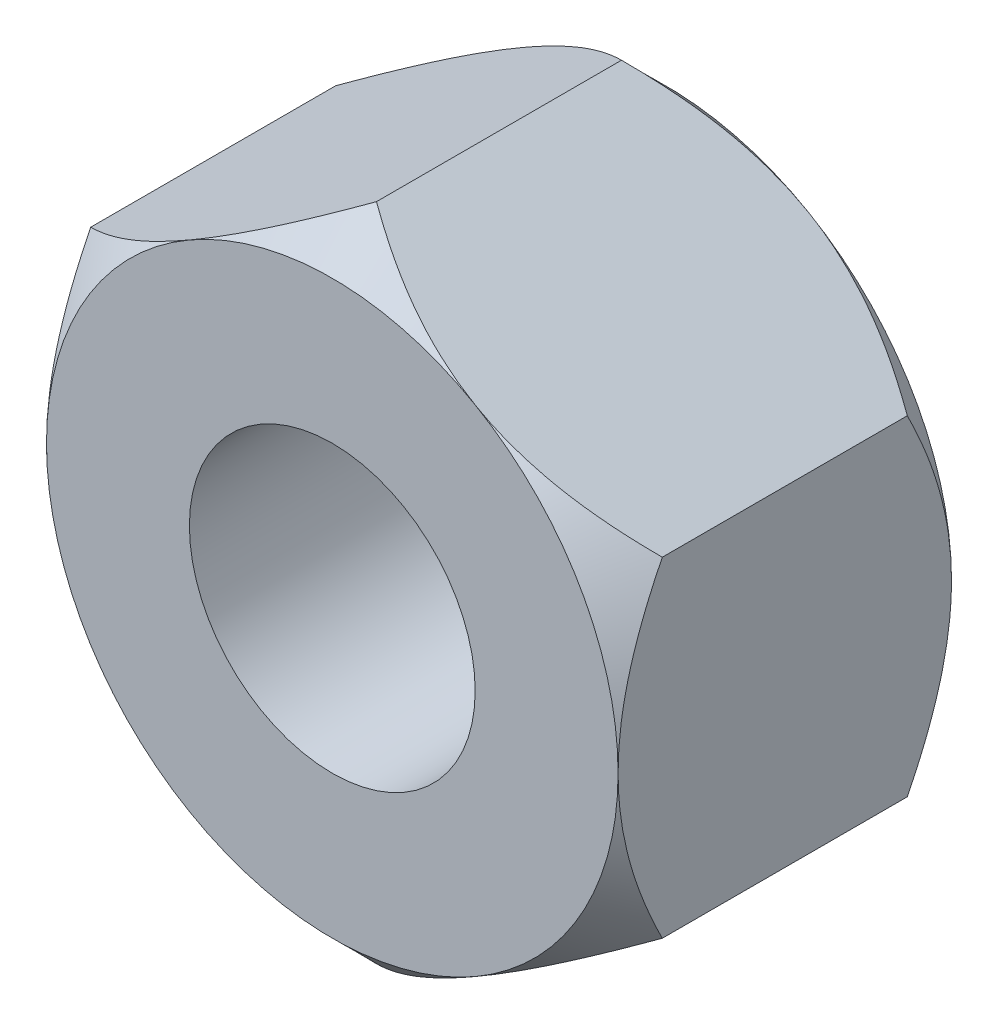
ISO-10303-21;
HEADER;
FILE_DESCRIPTION(('STEP AP214'),'2;1');
FILE_NAME('part.step','',(''),(''),'','','');
FILE_SCHEMA(('AUTOMOTIVE_DESIGN { 1 0 10303 214 1 1 1 1 }'));
ENDSEC;
DATA;
#1=APPLICATION_CONTEXT('core data for automotive mechanical design processes');
#2=APPLICATION_PROTOCOL_DEFINITION('international standard','automotive_design',2000,#1);
#3=PRODUCT_CONTEXT('',#1,'mechanical');
#4=PRODUCT('Part','Part','',(#3));
#5=PRODUCT_RELATED_PRODUCT_CATEGORY('part','',(#4));
#6=PRODUCT_DEFINITION_FORMATION('','',#4);
#7=PRODUCT_DEFINITION_CONTEXT('part definition',#1,'design');
#8=PRODUCT_DEFINITION('design','',#6,#7);
#9=PRODUCT_DEFINITION_SHAPE('','',#8);
#10=(LENGTH_UNIT() NAMED_UNIT(*) SI_UNIT(.MILLI.,.METRE.));
#11=(NAMED_UNIT(*) PLANE_ANGLE_UNIT() SI_UNIT($,.RADIAN.));
#12=(NAMED_UNIT(*) SI_UNIT($,.STERADIAN.) SOLID_ANGLE_UNIT());
#13=UNCERTAINTY_MEASURE_WITH_UNIT(LENGTH_MEASURE(1.E-05),#10,'distance_accuracy_value','');
#14=(GEOMETRIC_REPRESENTATION_CONTEXT(3) GLOBAL_UNCERTAINTY_ASSIGNED_CONTEXT((#13)) GLOBAL_UNIT_ASSIGNED_CONTEXT((#10,
#11,#12)) REPRESENTATION_CONTEXT('',''));
#15=CARTESIAN_POINT('',(0.,0.,0.));
#16=DIRECTION('',(0.,0.,1.));
#17=DIRECTION('',(1.,0.,0.));
#18=AXIS2_PLACEMENT_3D('',#15,#16,#17);
#19=CARTESIAN_POINT('',(0.,0.,3.5));
#20=DIRECTION('',(0.,0.,1.));
#21=DIRECTION('',(1.,0.,0.));
#22=AXIS2_PLACEMENT_3D('',#19,#20,#21);
#23=PLANE('',#22);
#24=CARTESIAN_POINT('',(0.,0.,3.5));
#25=DIRECTION('',(0.,0.,1.));
#26=DIRECTION('',(1.,0.,0.));
#27=AXIS2_PLACEMENT_3D('',#24,#25,#26);
#28=CIRCLE('',#27,1.5);
#29=CARTESIAN_POINT('',(1.5,0.,3.5));
#30=VERTEX_POINT('',#29);
#31=EDGE_CURVE('E236',#30,#30,#28,.T.);
#32=ORIENTED_EDGE('',*,*,#31,.F.);
#33=EDGE_LOOP('',(#32));
#34=FACE_BOUND('',#33,.T.);
#35=CARTESIAN_POINT('',(0.,0.,3.5));
#36=DIRECTION('',(0.,0.,1.));
#37=DIRECTION('',(1.,0.,0.));
#38=AXIS2_PLACEMENT_3D('',#35,#36,#37);
#39=CIRCLE('',#38,3.);
#40=CARTESIAN_POINT('',(1.5,-2.59807621135332,3.5));
#41=VERTEX_POINT('',#40);
#42=CARTESIAN_POINT('',(3.,0.,3.5));
#43=VERTEX_POINT('',#42);
#44=EDGE_CURVE('E291',#41,#43,#39,.T.);
#45=ORIENTED_EDGE('',*,*,#44,.T.);
#46=CARTESIAN_POINT('',(1.5,2.59807621135332,3.5));
#47=VERTEX_POINT('',#46);
#48=EDGE_CURVE('E294',#43,#47,#39,.T.);
#49=ORIENTED_EDGE('',*,*,#48,.T.);
#50=CARTESIAN_POINT('',(-1.5,2.59807621135332,3.5));
#51=VERTEX_POINT('',#50);
#52=EDGE_CURVE('E301',#47,#51,#39,.T.);
#53=ORIENTED_EDGE('',*,*,#52,.T.);
#54=CARTESIAN_POINT('',(-3.,0.,3.5));
#55=VERTEX_POINT('',#54);
#56=EDGE_CURVE('E305',#51,#55,#39,.T.);
#57=ORIENTED_EDGE('',*,*,#56,.T.);
#58=CARTESIAN_POINT('',(-1.5,-2.59807621135332,3.5));
#59=VERTEX_POINT('',#58);
#60=EDGE_CURVE('E298',#55,#59,#39,.T.);
#61=ORIENTED_EDGE('',*,*,#60,.T.);
#62=EDGE_CURVE('E293',#59,#41,#39,.T.);
#63=ORIENTED_EDGE('',*,*,#62,.T.);
#64=EDGE_LOOP('',(#45,#49,#53,#57,#61,#63));
#65=FACE_BOUND('',#64,.T.);
#66=ADVANCED_FACE('F38',(#34,#65),#23,.T.);
#67=CARTESIAN_POINT('',(-3.,-1.73205080756888,3.5));
#68=DIRECTION('',(0.5,0.866025403784439,0.));
#69=DIRECTION('',(-0.866025403784439,0.5,0.));
#70=AXIS2_PLACEMENT_3D('',#67,#68,#69);
#71=PLANE('',#70);
#72=DIRECTION('',(0.,0.,-1.));
#73=VECTOR('',#72,1.);
#74=CARTESIAN_POINT('',(-3.,-1.73205080756888,3.5));
#75=LINE('',#74,#73);
#76=CARTESIAN_POINT('',(-3.,-1.73205080756888,3.03589838486225));
#77=VERTEX_POINT('',#76);
#78=CARTESIAN_POINT('',(-3.,-1.73205080756888,0.464101615137751));
#79=VERTEX_POINT('',#78);
#80=EDGE_CURVE('E233',#77,#79,#75,.T.);
#81=ORIENTED_EDGE('',*,*,#80,.T.);
#82=CARTESIAN_POINT('',(-3.0002,-1.73193533751504,0.464217090964899));
#83=CARTESIAN_POINT('',(-2.89707648504425,-1.79147372663452,0.404729933459537));
#84=CARTESIAN_POINT('',(-2.79222861066935,-1.85200767512883,0.34873659460327));
#85=CARTESIAN_POINT('',(-2.5784323282189,-1.97544301635334,0.246214211516693));
#86=CARTESIAN_POINT('',(-2.46946358862024,-2.03835614749388,0.199742208879042));
#87=CARTESIAN_POINT('',(-2.24973336040297,-2.16521745390422,0.120134803654049));
#88=CARTESIAN_POINT('',(-2.13902782823779,-2.22913332270057,0.0867993157804192));
#89=CARTESIAN_POINT('',(-1.91517958943467,-2.35837216363117,0.0354391591170572));
#90=CARTESIAN_POINT('',(-1.802043720793,-2.42369118784644,0.017376152673354));
#91=CARTESIAN_POINT('',(-1.60705904380729,-2.53626564359199,0.00107852358824866));
#92=CARTESIAN_POINT('',(-1.52546204599786,-2.58337569224233,-0.00133401768844088));
#93=CARTESIAN_POINT('',(-1.36240077116991,-2.67751916315866,0.00273104979486579));
#94=CARTESIAN_POINT('',(-1.28093655070101,-2.7245525527757,0.00921177516605851));
#95=CARTESIAN_POINT('',(-1.11877988766163,-2.81817374583238,0.0306933376529761));
#96=CARTESIAN_POINT('',(-1.03808841121569,-2.86476099147974,0.0457037051050315));
#97=CARTESIAN_POINT('',(-0.87809130210866,-2.95713536549225,0.0834252612037665));
#98=CARTESIAN_POINT('',(-0.798785563690699,-3.00292255491614,0.106135859460585));
#99=CARTESIAN_POINT('',(-0.657993859197242,-3.08420868340511,0.152862299991696));
#100=CARTESIAN_POINT('',(-0.59619627785397,-3.11988753362891,0.175649942818551));
#101=CARTESIAN_POINT('',(-0.473710582479777,-3.19060468282508,0.224897901195199));
#102=CARTESIAN_POINT('',(-0.413022502364393,-3.2256429622163,0.251358328803949));
#103=CARTESIAN_POINT('',(-0.292947002609134,-3.29496858432308,0.307358609529113));
#104=CARTESIAN_POINT('',(-0.23355616770408,-3.32925789884291,0.336888779616121));
#105=CARTESIAN_POINT('',(-0.11587443853273,-3.39720147685869,0.39864070671328));
#106=CARTESIAN_POINT('',(-0.0575828957522648,-3.43085611477447,0.430860811797107));
#107=CARTESIAN_POINT('',(0.000200000000001076,-3.46421708519159,0.4642170909649));
#108=B_SPLINE_CURVE_WITH_KNOTS('',3,(#82,#83,#84,#85,#86,#87,#88,#89,#90,#91,#92,#93,#94,#95,
#96,#97,#98,#99,#100,#101,#102,#103,#104,#105,#106,#107),.UNSPECIFIED.,.F.,.F.,(4,2,2,2,2,2,2,2,
2,2,2,2,4),(0.,0.399603557139307,0.801535286397846,1.19708369162343,1.59163620080173,
1.87398941755845,2.15644160919093,2.43921001247425,2.72195674032138,2.94657516661927,
3.17120044767274,3.3951375283781,3.61893808380739),.UNSPECIFIED.);
#109=CARTESIAN_POINT('',(-1.5,-2.59807621135332,0.));
#110=VERTEX_POINT('',#109);
#111=EDGE_CURVE('E61',#79,#110,#108,.T.);
#112=ORIENTED_EDGE('',*,*,#111,.T.);
#113=CARTESIAN_POINT('',(0.,-3.46410161513775,0.464101615137752));
#114=VERTEX_POINT('',#113);
#115=EDGE_CURVE('E194',#110,#114,#108,.T.);
#116=ORIENTED_EDGE('',*,*,#115,.T.);
#117=DIRECTION('',(0.,0.,-1.));
#118=VECTOR('',#117,1.);
#119=CARTESIAN_POINT('',(0.,-3.46410161513775,3.5));
#120=LINE('',#119,#118);
#121=CARTESIAN_POINT('',(0.,-3.46410161513775,3.03589838486225));
#122=VERTEX_POINT('',#121);
#123=EDGE_CURVE('E221',#122,#114,#120,.T.);
#124=ORIENTED_EDGE('',*,*,#123,.F.);
#125=CARTESIAN_POINT('',(-3.0002,-1.73193533751504,3.0357829090351));
#126=CARTESIAN_POINT('',(-2.89707648504425,-1.79147372663452,3.09527006654046));
#127=CARTESIAN_POINT('',(-2.79222861066935,-1.85200767512883,3.15126340539673));
#128=CARTESIAN_POINT('',(-2.5784323282189,-1.97544301635334,3.25378578848331));
#129=CARTESIAN_POINT('',(-2.46946358862024,-2.03835614749388,3.30025779112096));
#130=CARTESIAN_POINT('',(-2.24973336040297,-2.16521745390422,3.37986519634595));
#131=CARTESIAN_POINT('',(-2.13902782823779,-2.22913332270057,3.41320068421958));
#132=CARTESIAN_POINT('',(-1.91517958943467,-2.35837216363117,3.46456084088294));
#133=CARTESIAN_POINT('',(-1.802043720793,-2.42369118784644,3.48262384732665));
#134=CARTESIAN_POINT('',(-1.60705904380729,-2.53626564359199,3.49892147641175));
#135=CARTESIAN_POINT('',(-1.52546204599786,-2.58337569224233,3.50133401768844));
#136=CARTESIAN_POINT('',(-1.36240077116991,-2.67751916315866,3.49726895020513));
#137=CARTESIAN_POINT('',(-1.28093655070101,-2.7245525527757,3.49078822483394));
#138=CARTESIAN_POINT('',(-1.11877988766163,-2.81817374583238,3.46930666234702));
#139=CARTESIAN_POINT('',(-1.03808841121569,-2.86476099147974,3.45429629489497));
#140=CARTESIAN_POINT('',(-0.87809130210866,-2.95713536549225,3.41657473879623));
#141=CARTESIAN_POINT('',(-0.798785563690699,-3.00292255491614,3.39386414053942));
#142=CARTESIAN_POINT('',(-0.657993859197243,-3.08420868340511,3.3471377000083));
#143=CARTESIAN_POINT('',(-0.59619627785397,-3.11988753362891,3.32435005718145));
#144=CARTESIAN_POINT('',(-0.473710582479777,-3.19060468282508,3.2751020988048));
#145=CARTESIAN_POINT('',(-0.413022502364394,-3.2256429622163,3.24864167119605));
#146=CARTESIAN_POINT('',(-0.292947002609135,-3.29496858432308,3.19264139047089));
#147=CARTESIAN_POINT('',(-0.23355616770408,-3.32925789884291,3.16311122038388));
#148=CARTESIAN_POINT('',(-0.11587443853273,-3.39720147685869,3.10135929328672));
#149=CARTESIAN_POINT('',(-0.0575828957522648,-3.43085611477447,3.06913918820289));
#150=CARTESIAN_POINT('',(0.000200000000000807,-3.46421708519159,3.0357829090351));
#151=B_SPLINE_CURVE_WITH_KNOTS('',3,(#125,#126,#127,#128,#129,#130,#131,#132,#133,#134,#135,
#136,#137,#138,#139,#140,#141,#142,#143,#144,#145,#146,#147,#148,#149,#150),.UNSPECIFIED.,.F.,
.F.,(4,2,2,2,2,2,2,2,2,2,2,2,4),(0.,0.399603557139306,0.801535286397846,1.19708369162343,
1.59163620080173,1.87398941755845,2.15644160919093,2.43921001247425,2.72195674032138,
2.94657516661927,3.17120044767274,3.3951375283781,3.61893808380739),.UNSPECIFIED.);
#152=EDGE_CURVE('E243',#59,#122,#151,.T.);
#153=ORIENTED_EDGE('',*,*,#152,.F.);
#154=EDGE_CURVE('E240',#77,#59,#151,.T.);
#155=ORIENTED_EDGE('',*,*,#154,.F.);
#156=EDGE_LOOP('',(#81,#112,#116,#124,#153,#155));
#157=FACE_BOUND('',#156,.T.);
#158=ADVANCED_FACE('F40',(#157),#71,.F.);
#159=CARTESIAN_POINT('',(0.,-3.46410161513775,3.5));
#160=DIRECTION('',(-0.5,0.866025403784439,0.));
#161=DIRECTION('',(-0.866025403784439,-0.5,0.));
#162=AXIS2_PLACEMENT_3D('',#159,#160,#161);
#163=PLANE('',#162);
#164=ORIENTED_EDGE('',*,*,#123,.T.);
#165=CARTESIAN_POINT('',(-0.000199999999999186,-3.46421708519159,0.4642170909649));
#166=CARTESIAN_POINT('',(0.102923514955749,-3.40467869607211,0.404729933459537));
#167=CARTESIAN_POINT('',(0.207771389330651,-3.3441447475778,0.34873659460327));
#168=CARTESIAN_POINT('',(0.421567671781097,-3.22070940635329,0.246214211516693));
#169=CARTESIAN_POINT('',(0.530536411379761,-3.15779627521275,0.199742208879043));
#170=CARTESIAN_POINT('',(0.75026663959703,-3.03093496880241,0.12013480365405));
#171=CARTESIAN_POINT('',(0.860972171762213,-2.96701910000606,0.0867993157804194));
#172=CARTESIAN_POINT('',(1.08482041056533,-2.83778025907546,0.0354391591170574));
#173=CARTESIAN_POINT('',(1.197956279207,-2.77246123486019,0.017376152673355));
#174=CARTESIAN_POINT('',(1.3929409561927,-2.65988677911464,0.00107852358824954));
#175=CARTESIAN_POINT('',(1.47453795400214,-2.6127767304643,-0.00133401768844054));
#176=CARTESIAN_POINT('',(1.63759922883009,-2.51863325954798,0.00273104979486588));
#177=CARTESIAN_POINT('',(1.71906344929899,-2.47159986993094,0.0092117751660589));
#178=CARTESIAN_POINT('',(1.88122011233837,-2.37797867687426,0.0306933376529766));
#179=CARTESIAN_POINT('',(1.96191158878431,-2.33139143122689,0.0457037051050318));
#180=CARTESIAN_POINT('',(2.12190869789134,-2.23901705721438,0.0834252612037663));
#181=CARTESIAN_POINT('',(2.2012144363093,-2.19322986779049,0.106135859460584));
#182=CARTESIAN_POINT('',(2.34200614080276,-2.11194373930153,0.152862299991696));
#183=CARTESIAN_POINT('',(2.40380372214603,-2.07626488907772,0.175649942818551));
#184=CARTESIAN_POINT('',(2.52628941752022,-2.00554773988155,0.224897901195199));
#185=CARTESIAN_POINT('',(2.58697749763561,-1.97050946049033,0.251358328803949));
#186=CARTESIAN_POINT('',(2.70705299739086,-1.90118383838356,0.307358609529112));
#187=CARTESIAN_POINT('',(2.76644383229592,-1.86689452386373,0.336888779616121));
#188=CARTESIAN_POINT('',(2.88412556146727,-1.79895094584795,0.398640706713279));
#189=CARTESIAN_POINT('',(2.94241710424773,-1.76529630793217,0.430860811797107));
#190=CARTESIAN_POINT('',(3.0002,-1.73193533751504,0.4642170909649));
#191=B_SPLINE_CURVE_WITH_KNOTS('',3,(#165,#166,#167,#168,#169,#170,#171,#172,#173,#174,#175,
#176,#177,#178,#179,#180,#181,#182,#183,#184,#185,#186,#187,#188,#189,#190),.UNSPECIFIED.,.F.,
.F.,(4,2,2,2,2,2,2,2,2,2,2,2,4),(0.,0.399603557139307,0.801535286397846,1.19708369162343,
1.59163620080173,1.87398941755844,2.15644160919093,2.43921001247425,2.72195674032138,
2.94657516661927,3.17120044767274,3.3951375283781,3.61893808380739),.UNSPECIFIED.);
#192=CARTESIAN_POINT('',(1.5,-2.59807621135332,0.));
#193=VERTEX_POINT('',#192);
#194=EDGE_CURVE('E272',#114,#193,#191,.T.);
#195=ORIENTED_EDGE('',*,*,#194,.T.);
#196=CARTESIAN_POINT('',(3.,-1.73205080756888,0.464101615137751));
#197=VERTEX_POINT('',#196);
#198=EDGE_CURVE('E267',#193,#197,#191,.T.);
#199=ORIENTED_EDGE('',*,*,#198,.T.);
#200=DIRECTION('',(0.,0.,-1.));
#201=VECTOR('',#200,1.);
#202=CARTESIAN_POINT('',(3.,-1.73205080756888,3.5));
#203=LINE('',#202,#201);
#204=CARTESIAN_POINT('',(3.,-1.73205080756888,3.03589838486225));
#205=VERTEX_POINT('',#204);
#206=EDGE_CURVE('E224',#205,#197,#203,.T.);
#207=ORIENTED_EDGE('',*,*,#206,.F.);
#208=CARTESIAN_POINT('',(-0.000199999999999186,-3.46421708519159,3.0357829090351));
#209=CARTESIAN_POINT('',(0.102923514955749,-3.40467869607211,3.09527006654046));
#210=CARTESIAN_POINT('',(0.207771389330651,-3.3441447475778,3.15126340539673));
#211=CARTESIAN_POINT('',(0.421567671781097,-3.22070940635329,3.25378578848331));
#212=CARTESIAN_POINT('',(0.530536411379761,-3.15779627521275,3.30025779112096));
#213=CARTESIAN_POINT('',(0.75026663959703,-3.03093496880241,3.37986519634595));
#214=CARTESIAN_POINT('',(0.860972171762213,-2.96701910000606,3.41320068421958));
#215=CARTESIAN_POINT('',(1.08482041056533,-2.83778025907546,3.46456084088294));
#216=CARTESIAN_POINT('',(1.197956279207,-2.77246123486019,3.48262384732664));
#217=CARTESIAN_POINT('',(1.3929409561927,-2.65988677911464,3.49892147641175));
#218=CARTESIAN_POINT('',(1.47453795400214,-2.6127767304643,3.50133401768844));
#219=CARTESIAN_POINT('',(1.63759922883009,-2.51863325954798,3.49726895020513));
#220=CARTESIAN_POINT('',(1.71906344929899,-2.47159986993094,3.49078822483394));
#221=CARTESIAN_POINT('',(1.88122011233837,-2.37797867687426,3.46930666234702));
#222=CARTESIAN_POINT('',(1.96191158878431,-2.33139143122689,3.45429629489497));
#223=CARTESIAN_POINT('',(2.12190869789134,-2.23901705721438,3.41657473879623));
#224=CARTESIAN_POINT('',(2.2012144363093,-2.19322986779049,3.39386414053942));
#225=CARTESIAN_POINT('',(2.34200614080276,-2.11194373930153,3.3471377000083));
#226=CARTESIAN_POINT('',(2.40380372214603,-2.07626488907772,3.32435005718145));
#227=CARTESIAN_POINT('',(2.52628941752022,-2.00554773988155,3.2751020988048));
#228=CARTESIAN_POINT('',(2.58697749763561,-1.97050946049033,3.24864167119605));
#229=CARTESIAN_POINT('',(2.70705299739086,-1.90118383838356,3.19264139047089));
#230=CARTESIAN_POINT('',(2.76644383229592,-1.86689452386373,3.16311122038388));
#231=CARTESIAN_POINT('',(2.88412556146727,-1.79895094584795,3.10135929328672));
#232=CARTESIAN_POINT('',(2.94241710424773,-1.76529630793217,3.06913918820289));
#233=CARTESIAN_POINT('',(3.0002,-1.73193533751504,3.0357829090351));
#234=B_SPLINE_CURVE_WITH_KNOTS('',3,(#208,#209,#210,#211,#212,#213,#214,#215,#216,#217,#218,
#219,#220,#221,#222,#223,#224,#225,#226,#227,#228,#229,#230,#231,#232,#233),.UNSPECIFIED.,.F.,
.F.,(4,2,2,2,2,2,2,2,2,2,2,2,4),(0.,0.399603557139307,0.801535286397846,1.19708369162343,
1.59163620080173,1.87398941755844,2.15644160919093,2.43921001247425,2.72195674032138,
2.94657516661927,3.17120044767274,3.3951375283781,3.61893808380739),.UNSPECIFIED.);
#235=EDGE_CURVE('E249',#41,#205,#234,.T.);
#236=ORIENTED_EDGE('',*,*,#235,.F.);
#237=EDGE_CURVE('E248',#122,#41,#234,.T.);
#238=ORIENTED_EDGE('',*,*,#237,.F.);
#239=EDGE_LOOP('',(#164,#195,#199,#207,#236,#238));
#240=FACE_BOUND('',#239,.T.);
#241=ADVANCED_FACE('F260',(#240),#163,.F.);
#242=CARTESIAN_POINT('',(3.,-1.73205080756888,3.5));
#243=DIRECTION('',(-1.,0.,0.));
#244=DIRECTION('',(0.,-1.,0.));
#245=AXIS2_PLACEMENT_3D('',#242,#243,#244);
#246=PLANE('',#245);
#247=ORIENTED_EDGE('',*,*,#206,.T.);
#248=CARTESIAN_POINT('',(3.,-4.26502277923611,2.21444333629227));
#249=CARTESIAN_POINT('',(3.,-4.15763452396089,2.12663019558416));
#250=CARTESIAN_POINT('',(3.,-4.04972440785755,2.03944512893937));
#251=CARTESIAN_POINT('',(3.,-3.83259637368331,1.86666313094969));
#252=CARTESIAN_POINT('',(3.,-3.72337812803454,1.781066611689));
#253=CARTESIAN_POINT('',(3.,-3.50221990894043,1.61091223454472));
#254=CARTESIAN_POINT('',(3.,-3.39026322717329,1.52637602157815));
#255=CARTESIAN_POINT('',(3.,-3.16449137630576,1.35983846549838));
#256=CARTESIAN_POINT('',(3.,-3.05067638644123,1.27783688009906));
#257=CARTESIAN_POINT('',(3.,-2.81025663592596,1.10968225535804));
#258=CARTESIAN_POINT('',(3.,-2.68343534743381,1.02383704093701));
#259=CARTESIAN_POINT('',(3.,-2.42643121326594,0.857199455653706));
#260=CARTESIAN_POINT('',(3.,-2.29624730614931,0.776408708513095));
#261=CARTESIAN_POINT('',(3.,-2.0324258519283,0.62206486022886));
#262=CARTESIAN_POINT('',(3.,-1.89880699672558,0.548480105013826));
#263=CARTESIAN_POINT('',(3.,-1.62685474911182,0.410707399585327));
#264=CARTESIAN_POINT('',(3.,-1.4885255073135,0.346511427631044));
#265=CARTESIAN_POINT('',(3.,-1.24643134297894,0.24732275717201));
#266=CARTESIAN_POINT('',(3.,-1.14395582548338,0.209205694538778));
#267=CARTESIAN_POINT('',(3.,-0.936256079962178,0.141170793945545));
#268=CARTESIAN_POINT('',(3.,-0.83103147651528,0.111254082322104));
#269=CARTESIAN_POINT('',(3.,-0.620565596633722,0.061843056166556));
#270=CARTESIAN_POINT('',(3.,-0.515375626716117,0.0421339070246179));
#271=CARTESIAN_POINT('',(3.,-0.303528997273083,0.0134919710259382));
#272=CARTESIAN_POINT('',(3.,-0.196872684671046,0.00455667808303546));
#273=CARTESIAN_POINT('',(3.,0.0113757144186371,-0.00169233617503264));
#274=CARTESIAN_POINT('',(3.,0.112950857288305,0.000428553700258739));
#275=CARTESIAN_POINT('',(3.,0.315369989310345,0.0148402471743275));
#276=CARTESIAN_POINT('',(3.,0.416213924950845,0.0271317876624491));
#277=CARTESIAN_POINT('',(3.,0.618203418723708,0.0613832365806027));
#278=CARTESIAN_POINT('',(3.,0.719317908140612,0.0835234325035891));
#279=CARTESIAN_POINT('',(3.,0.919283448121024,0.136204407098527));
#280=CARTESIAN_POINT('',(3.,1.01813455378726,0.166744981024805));
#281=CARTESIAN_POINT('',(3.,1.31691602686962,0.270874207202913));
#282=CARTESIAN_POINT('',(3.,1.51291306900318,0.35577678540193));
#283=CARTESIAN_POINT('',(3.,1.79979053693328,0.497476254723698));
#284=CARTESIAN_POINT('',(3.,1.8944031589756,0.547208693861817));
#285=CARTESIAN_POINT('',(3.,2.08149179826815,0.650550729237345));
#286=CARTESIAN_POINT('',(3.,2.17396818145191,0.704159654843765));
#287=CARTESIAN_POINT('',(3.,2.35250420992118,0.811752725225054));
#288=CARTESIAN_POINT('',(3.,2.43865504230403,0.865587250626681));
#289=CARTESIAN_POINT('',(3.,2.60947826828265,0.975563807780219));
#290=CARTESIAN_POINT('',(3.,2.69415055144059,1.0317060108588));
#291=CARTESIAN_POINT('',(3.,2.86153191325514,1.14543331285005));
#292=CARTESIAN_POINT('',(3.,2.94425125331988,1.20300337181797));
#293=CARTESIAN_POINT('',(3.,3.10855304187136,1.31969806675798));
#294=CARTESIAN_POINT('',(3.,3.19013579737264,1.37882226995921));
#295=CARTESIAN_POINT('',(3.,3.27124151485246,1.43858322536529));
#296=B_SPLINE_CURVE_WITH_KNOTS('',3,(#248,#249,#250,#251,#252,#253,#254,#255,#256,#257,#258,
#259,#260,#261,#262,#263,#264,#265,#266,#267,#268,#269,#270,#271,#272,#273,#274,#275,#276,#277,
#278,#279,#280,#281,#282,#283,#284,#285,#286,#287,#288,#289,#290,#291,#292,#293,#294,#295),
.UNSPECIFIED.,.F.,.F.,(4,2,2,2,2,2,2,2,2,2,2,2,2,2,2,2,2,2,2,2,2,2,2,4),(0.,0.416168705024011,
0.832443900251405,1.25327850023867,1.67407274727303,2.13341402629513,2.59290211657001,
3.05027157776782,3.50724795226643,3.83497888242671,4.16275480463283,4.48331888040365,
4.80380837598198,5.10807467807275,5.41236302695664,5.72246678120497,6.03256297784378,
6.67138469586525,6.99201770318782,7.31259537319668,7.61732190355523,7.9220710984374,
8.22439485046945,8.52663529033319),.UNSPECIFIED.);
#297=CARTESIAN_POINT('',(3.,0.,0.));
#298=VERTEX_POINT('',#297);
#299=EDGE_CURVE('E162',#197,#298,#296,.T.);
#300=ORIENTED_EDGE('',*,*,#299,.T.);
#301=CARTESIAN_POINT('',(3.,1.73205080756888,0.464101615137752));
#302=VERTEX_POINT('',#301);
#303=EDGE_CURVE('E146',#298,#302,#296,.T.);
#304=ORIENTED_EDGE('',*,*,#303,.T.);
#305=DIRECTION('',(0.,0.,-1.));
#306=VECTOR('',#305,1.);
#307=CARTESIAN_POINT('',(3.,1.73205080756888,3.5));
#308=LINE('',#307,#306);
#309=CARTESIAN_POINT('',(3.,1.73205080756888,3.03589838486225));
#310=VERTEX_POINT('',#309);
#311=EDGE_CURVE('E161',#310,#302,#308,.T.);
#312=ORIENTED_EDGE('',*,*,#311,.F.);
#313=CARTESIAN_POINT('',(3.,-4.29844242128203,1.25818664495989));
#314=CARTESIAN_POINT('',(3.,-4.19022759654751,1.34690346108895));
#315=CARTESIAN_POINT('',(3.,-4.08149104525116,1.43499391719157));
#316=CARTESIAN_POINT('',(3.,-3.86270885341887,1.60958986935027));
#317=CARTESIAN_POINT('',(3.,-3.75266288675042,1.69609495631252));
#318=CARTESIAN_POINT('',(3.,-3.52983421590501,1.86808161895986));
#319=CARTESIAN_POINT('',(3.,-3.41703472894551,1.9535415220078));
#320=CARTESIAN_POINT('',(3.,-3.18957179467371,2.12192769164742));
#321=CARTESIAN_POINT('',(3.,-3.07490852848817,2.20485420221172));
#322=CARTESIAN_POINT('',(3.,-2.83252370517095,2.37506892841489));
#323=CARTESIAN_POINT('',(3.,-2.70458080545918,2.46204373917236));
#324=CARTESIAN_POINT('',(3.,-2.44530089882166,2.63091626092071));
#325=CARTESIAN_POINT('',(3.,-2.31396280345392,2.71281231441776));
#326=CARTESIAN_POINT('',(3.,-2.0477915687965,2.86931056059257));
#327=CARTESIAN_POINT('',(3.,-1.91297743948888,2.94394478551338));
#328=CARTESIAN_POINT('',(3.,-1.63856147834361,3.0837221284409));
#329=CARTESIAN_POINT('',(3.,-1.49896391433681,3.14887344813114));
#330=CARTESIAN_POINT('',(3.,-1.25518755486715,3.24931252696271));
#331=CARTESIAN_POINT('',(3.,-1.15233884171839,3.28780522510602));
#332=CARTESIAN_POINT('',(3.,-0.943863974842227,3.35656213755512));
#333=CARTESIAN_POINT('',(3.,-0.838237442725441,3.38682522440434));
#334=CARTESIAN_POINT('',(3.,-0.626964933403313,3.43686422106247));
#335=CARTESIAN_POINT('',(3.,-0.521371471682516,3.45685808341474));
#336=CARTESIAN_POINT('',(3.,-0.308688238250866,3.48599744799656));
#337=CARTESIAN_POINT('',(3.,-0.201598828288462,3.49514552851833));
#338=CARTESIAN_POINT('',(3.,0.00738545773679191,3.5017145938327));
#339=CARTESIAN_POINT('',(3.,0.109262021254506,3.49971857389792));
#340=CARTESIAN_POINT('',(3.,0.312290719302784,3.48549076372365));
#341=CARTESIAN_POINT('',(3.,0.413442801897263,3.47325824691985));
#342=CARTESIAN_POINT('',(3.,0.616060024411217,3.43905976703426));
#343=CARTESIAN_POINT('',(3.,0.717493871771561,3.41691139342483));
#344=CARTESIAN_POINT('',(3.,0.918086578448122,3.36415594870883));
#345=CARTESIAN_POINT('',(3.,1.0172454836139,3.33354904823927));
#346=CARTESIAN_POINT('',(3.,1.3162111339868,3.22940393739902));
#347=CARTESIAN_POINT('',(3.,1.5120981887798,3.14458702922727));
#348=CARTESIAN_POINT('',(3.,1.79881713497913,3.00302373253711));
#349=CARTESIAN_POINT('',(3.,1.89337755595734,2.95333827433723));
#350=CARTESIAN_POINT('',(3.,2.08036349754139,2.8500918509221));
#351=CARTESIAN_POINT('',(3.,2.17278938301316,2.79653155461667));
#352=CARTESIAN_POINT('',(3.,2.35122909782561,2.68903368112728));
#353=CARTESIAN_POINT('',(3.,2.43733403503846,2.63524564643642));
#354=CARTESIAN_POINT('',(3.,2.60806622958044,2.52536255129227));
#355=CARTESIAN_POINT('',(3.,2.69269337666759,2.46926731976241));
#356=CARTESIAN_POINT('',(3.,2.85998608178794,2.35563335120271));
#357=CARTESIAN_POINT('',(3.,2.94266188601894,2.29810963620453));
#358=CARTESIAN_POINT('',(3.,3.10687698445445,2.18150771272712));
#359=CARTESIAN_POINT('',(3.,3.18841658554522,2.12242993695377));
#360=CARTESIAN_POINT('',(3.,3.26947925792041,2.06271540038598));
#361=B_SPLINE_CURVE_WITH_KNOTS('',3,(#313,#314,#315,#316,#317,#318,#319,#320,#321,#322,#323,
#324,#325,#326,#327,#328,#329,#330,#331,#332,#333,#334,#335,#336,#337,#338,#339,#340,#341,#342,
#343,#344,#345,#346,#347,#348,#349,#350,#351,#352,#353,#354,#355,#356,#357,#358,#359,#360),
.UNSPECIFIED.,.F.,.F.,(4,2,2,2,2,2,2,2,2,2,2,2,2,2,2,2,2,2,2,2,2,2,2,4),(0.,0.419804763824701,
0.839716372045637,1.26423938473457,1.68872138498947,2.15274965646036,2.61692857890997,
3.07895712667844,3.54058366463975,3.86975687587705,4.19897516114288,4.52088292552103,
4.84271414965269,5.14787218131844,5.45305187427585,5.76409226109855,6.07512637364564,
6.71354588910734,7.03397458361724,7.35434809419907,7.65888394417898,7.96344241607005,
8.26557954325446,8.56763341702351),.UNSPECIFIED.);
#362=EDGE_CURVE('E255',#43,#310,#361,.T.);
#363=ORIENTED_EDGE('',*,*,#362,.F.);
#364=EDGE_CURVE('E254',#205,#43,#361,.T.);
#365=ORIENTED_EDGE('',*,*,#364,.F.);
#366=EDGE_LOOP('',(#247,#300,#304,#312,#363,#365));
#367=FACE_BOUND('',#366,.T.);
#368=ADVANCED_FACE('F263',(#367),#246,.F.);
#369=CARTESIAN_POINT('',(3.,1.73205080756888,3.5));
#370=DIRECTION('',(-0.5,-0.866025403784439,0.));
#371=DIRECTION('',(0.866025403784439,-0.5,0.));
#372=AXIS2_PLACEMENT_3D('',#369,#370,#371);
#373=PLANE('',#372);
#374=ORIENTED_EDGE('',*,*,#311,.T.);
#375=CARTESIAN_POINT('',(3.0002,1.73193533751504,0.4642170909649));
#376=CARTESIAN_POINT('',(2.89707648504425,1.79147372663452,0.404729933459537));
#377=CARTESIAN_POINT('',(2.79222861066935,1.85200767512883,0.34873659460327));
#378=CARTESIAN_POINT('',(2.5784323282189,1.97544301635334,0.246214211516693));
#379=CARTESIAN_POINT('',(2.46946358862024,2.03835614749388,0.199742208879043));
#380=CARTESIAN_POINT('',(2.24973336040297,2.16521745390422,0.12013480365405));
#381=CARTESIAN_POINT('',(2.13902782823779,2.22913332270057,0.0867993157804198));
#382=CARTESIAN_POINT('',(1.91517958943467,2.35837216363117,0.0354391591170578));
#383=CARTESIAN_POINT('',(1.802043720793,2.42369118784644,0.0173761526733553));
#384=CARTESIAN_POINT('',(1.6070590438073,2.53626564359199,0.00107852358825011));
#385=CARTESIAN_POINT('',(1.52546204599786,2.58337569224233,-0.00133401768843967));
#386=CARTESIAN_POINT('',(1.36240077116991,2.67751916315866,0.00273104979486675));
#387=CARTESIAN_POINT('',(1.28093655070101,2.7245525527757,0.00921177516605946));
#388=CARTESIAN_POINT('',(1.11877988766163,2.81817374583238,0.0306933376529772));
#389=CARTESIAN_POINT('',(1.03808841121569,2.86476099147974,0.0457037051050326));
#390=CARTESIAN_POINT('',(0.878091302108661,2.95713536549225,0.0834252612037676));
#391=CARTESIAN_POINT('',(0.798785563690699,3.00292255491614,0.106135859460586));
#392=CARTESIAN_POINT('',(0.657993859197243,3.08420868340511,0.152862299991697));
#393=CARTESIAN_POINT('',(0.59619627785397,3.11988753362891,0.175649942818552));
#394=CARTESIAN_POINT('',(0.473710582479777,3.19060468282508,0.2248979011952));
#395=CARTESIAN_POINT('',(0.413022502364394,3.2256429622163,0.25135832880395));
#396=CARTESIAN_POINT('',(0.292947002609135,3.29496858432308,0.307358609529114));
#397=CARTESIAN_POINT('',(0.233556167704081,3.32925789884291,0.336888779616122));
#398=CARTESIAN_POINT('',(0.115874438532731,3.39720147685869,0.39864070671328));
#399=CARTESIAN_POINT('',(0.0575828957522653,3.43085611477447,0.430860811797108));
#400=CARTESIAN_POINT('',(-0.000200000000000185,3.46421708519159,0.464217090964901));
#401=B_SPLINE_CURVE_WITH_KNOTS('',3,(#375,#376,#377,#378,#379,#380,#381,#382,#383,#384,#385,
#386,#387,#388,#389,#390,#391,#392,#393,#394,#395,#396,#397,#398,#399,#400),.UNSPECIFIED.,.F.,
.F.,(4,2,2,2,2,2,2,2,2,2,2,2,4),(0.,0.399603557139306,0.801535286397846,1.19708369162343,
1.59163620080173,1.87398941755844,2.15644160919093,2.43921001247425,2.72195674032138,
2.94657516661927,3.17120044767274,3.3951375283781,3.61893808380739),.UNSPECIFIED.);
#402=CARTESIAN_POINT('',(1.5,2.59807621135332,0.));
#403=VERTEX_POINT('',#402);
#404=EDGE_CURVE('E139',#302,#403,#401,.T.);
#405=ORIENTED_EDGE('',*,*,#404,.T.);
#406=CARTESIAN_POINT('',(0.,3.46410161513776,0.464101615137753));
#407=VERTEX_POINT('',#406);
#408=EDGE_CURVE('E128',#403,#407,#401,.T.);
#409=ORIENTED_EDGE('',*,*,#408,.T.);
#410=DIRECTION('',(0.,0.,-1.));
#411=VECTOR('',#410,1.);
#412=CARTESIAN_POINT('',(0.,3.46410161513776,3.5));
#413=LINE('',#412,#411);
#414=CARTESIAN_POINT('',(0.,3.46410161513776,3.03589838486225));
#415=VERTEX_POINT('',#414);
#416=EDGE_CURVE('E228',#415,#407,#413,.T.);
#417=ORIENTED_EDGE('',*,*,#416,.F.);
#418=CARTESIAN_POINT('',(3.0002,1.73193533751504,3.0357829090351));
#419=CARTESIAN_POINT('',(2.89707648504425,1.79147372663452,3.09527006654046));
#420=CARTESIAN_POINT('',(2.79222861066935,1.85200767512883,3.15126340539673));
#421=CARTESIAN_POINT('',(2.5784323282189,1.97544301635334,3.25378578848331));
#422=CARTESIAN_POINT('',(2.46946358862024,2.03835614749388,3.30025779112096));
#423=CARTESIAN_POINT('',(2.24973336040297,2.16521745390422,3.37986519634595));
#424=CARTESIAN_POINT('',(2.13902782823779,2.22913332270057,3.41320068421958));
#425=CARTESIAN_POINT('',(1.91517958943467,2.35837216363117,3.46456084088294));
#426=CARTESIAN_POINT('',(1.802043720793,2.42369118784644,3.48262384732664));
#427=CARTESIAN_POINT('',(1.6070590438073,2.53626564359199,3.49892147641175));
#428=CARTESIAN_POINT('',(1.52546204599786,2.58337569224233,3.50133401768844));
#429=CARTESIAN_POINT('',(1.36240077116991,2.67751916315866,3.49726895020513));
#430=CARTESIAN_POINT('',(1.28093655070101,2.7245525527757,3.49078822483394));
#431=CARTESIAN_POINT('',(1.11877988766163,2.81817374583238,3.46930666234702));
#432=CARTESIAN_POINT('',(1.03808841121569,2.86476099147974,3.45429629489497));
#433=CARTESIAN_POINT('',(0.87809130210866,2.95713536549225,3.41657473879623));
#434=CARTESIAN_POINT('',(0.7987855636907,3.00292255491614,3.39386414053941));
#435=CARTESIAN_POINT('',(0.657993859197243,3.08420868340511,3.3471377000083));
#436=CARTESIAN_POINT('',(0.59619627785397,3.11988753362891,3.32435005718145));
#437=CARTESIAN_POINT('',(0.473710582479777,3.19060468282508,3.2751020988048));
#438=CARTESIAN_POINT('',(0.413022502364394,3.2256429622163,3.24864167119605));
#439=CARTESIAN_POINT('',(0.292947002609135,3.29496858432308,3.19264139047089));
#440=CARTESIAN_POINT('',(0.233556167704081,3.32925789884291,3.16311122038388));
#441=CARTESIAN_POINT('',(0.115874438532731,3.39720147685869,3.10135929328672));
#442=CARTESIAN_POINT('',(0.0575828957522656,3.43085611477447,3.06913918820289));
#443=CARTESIAN_POINT('',(-0.000199999999999747,3.46421708519159,3.0357829090351));
#444=B_SPLINE_CURVE_WITH_KNOTS('',3,(#418,#419,#420,#421,#422,#423,#424,#425,#426,#427,#428,
#429,#430,#431,#432,#433,#434,#435,#436,#437,#438,#439,#440,#441,#442,#443),.UNSPECIFIED.,.F.,
.F.,(4,2,2,2,2,2,2,2,2,2,2,2,4),(0.,0.399603557139306,0.801535286397846,1.19708369162343,
1.59163620080173,1.87398941755844,2.15644160919093,2.43921001247425,2.72195674032138,
2.94657516661927,3.17120044767274,3.3951375283781,3.61893808380739),.UNSPECIFIED.);
#445=EDGE_CURVE('E322',#47,#415,#444,.T.);
#446=ORIENTED_EDGE('',*,*,#445,.F.);
#447=EDGE_CURVE('E324',#310,#47,#444,.T.);
#448=ORIENTED_EDGE('',*,*,#447,.F.);
#449=EDGE_LOOP('',(#374,#405,#409,#417,#446,#448));
#450=FACE_BOUND('',#449,.T.);
#451=ADVANCED_FACE('F158',(#450),#373,.F.);
#452=CARTESIAN_POINT('',(0.,3.46410161513776,3.5));
#453=DIRECTION('',(0.5,-0.866025403784439,0.));
#454=DIRECTION('',(0.866025403784439,0.5,0.));
#455=AXIS2_PLACEMENT_3D('',#452,#453,#454);
#456=PLANE('',#455);
#457=ORIENTED_EDGE('',*,*,#416,.T.);
#458=CARTESIAN_POINT('',(0.000200000000000061,3.46421708519159,0.464217090964901));
#459=CARTESIAN_POINT('',(-0.102923514955748,3.40467869607211,0.404729933459538));
#460=CARTESIAN_POINT('',(-0.20777138933065,3.3441447475778,0.348736594603271));
#461=CARTESIAN_POINT('',(-0.421567671781096,3.2207094063533,0.246214211516694));
#462=CARTESIAN_POINT('',(-0.53053641137976,3.15779627521275,0.199742208879044));
#463=CARTESIAN_POINT('',(-0.75026663959703,3.03093496880241,0.120134803654051));
#464=CARTESIAN_POINT('',(-0.860972171762213,2.96701910000607,0.0867993157804208));
#465=CARTESIAN_POINT('',(-1.08482041056533,2.83778025907547,0.0354391591170584));
#466=CARTESIAN_POINT('',(-1.197956279207,2.7724612348602,0.0173761526733556));
#467=CARTESIAN_POINT('',(-1.3929409561927,2.65988677911464,0.00107852358825036));
#468=CARTESIAN_POINT('',(-1.47453795400214,2.6127767304643,-0.00133401768843926));
#469=CARTESIAN_POINT('',(-1.63759922883009,2.51863325954798,0.00273104979486721));
#470=CARTESIAN_POINT('',(-1.71906344929899,2.47159986993094,0.00921177516605982));
#471=CARTESIAN_POINT('',(-1.88122011233837,2.37797867687426,0.0306933376529777));
#472=CARTESIAN_POINT('',(-1.96191158878431,2.33139143122689,0.0457037051050334));
#473=CARTESIAN_POINT('',(-2.12190869789134,2.23901705721438,0.083425261203768));
#474=CARTESIAN_POINT('',(-2.2012144363093,2.19322986779049,0.106135859460585));
#475=CARTESIAN_POINT('',(-2.34200614080276,2.11194373930153,0.152862299991697));
#476=CARTESIAN_POINT('',(-2.40380372214603,2.07626488907772,0.175649942818553));
#477=CARTESIAN_POINT('',(-2.52628941752022,2.00554773988155,0.2248979011952));
#478=CARTESIAN_POINT('',(-2.58697749763561,1.97050946049034,0.25135832880395));
#479=CARTESIAN_POINT('',(-2.70705299739087,1.90118383838356,0.307358609529114));
#480=CARTESIAN_POINT('',(-2.76644383229592,1.86689452386373,0.336888779616123));
#481=CARTESIAN_POINT('',(-2.88412556146727,1.79895094584795,0.398640706713282));
#482=CARTESIAN_POINT('',(-2.94241710424774,1.76529630793217,0.430860811797109));
#483=CARTESIAN_POINT('',(-3.0002,1.73193533751504,0.464217090964902));
#484=B_SPLINE_CURVE_WITH_KNOTS('',3,(#458,#459,#460,#461,#462,#463,#464,#465,#466,#467,#468,
#469,#470,#471,#472,#473,#474,#475,#476,#477,#478,#479,#480,#481,#482,#483),.UNSPECIFIED.,.F.,
.F.,(4,2,2,2,2,2,2,2,2,2,2,2,4),(0.,0.399603557139306,0.801535286397846,1.19708369162343,
1.59163620080173,1.87398941755844,2.15644160919093,2.43921001247425,2.72195674032138,
2.94657516661927,3.17120044767275,3.3951375283781,3.61893808380739),.UNSPECIFIED.);
#485=CARTESIAN_POINT('',(-1.5,2.59807621135332,0.));
#486=VERTEX_POINT('',#485);
#487=EDGE_CURVE('E134',#407,#486,#484,.T.);
#488=ORIENTED_EDGE('',*,*,#487,.T.);
#489=CARTESIAN_POINT('',(-3.,1.73205080756888,0.464101615137754));
#490=VERTEX_POINT('',#489);
#491=EDGE_CURVE('E170',#486,#490,#484,.T.);
#492=ORIENTED_EDGE('',*,*,#491,.T.);
#493=DIRECTION('',(0.,0.,-1.));
#494=VECTOR('',#493,1.);
#495=CARTESIAN_POINT('',(-3.,1.73205080756888,3.5));
#496=LINE('',#495,#494);
#497=CARTESIAN_POINT('',(-3.,1.73205080756888,3.03589838486225));
#498=VERTEX_POINT('',#497);
#499=EDGE_CURVE('E230',#498,#490,#496,.T.);
#500=ORIENTED_EDGE('',*,*,#499,.F.);
#501=CARTESIAN_POINT('',(0.000200000000000035,3.46421708519159,3.0357829090351));
#502=CARTESIAN_POINT('',(-0.102923514955748,3.40467869607211,3.09527006654046));
#503=CARTESIAN_POINT('',(-0.20777138933065,3.3441447475778,3.15126340539673));
#504=CARTESIAN_POINT('',(-0.421567671781097,3.2207094063533,3.25378578848331));
#505=CARTESIAN_POINT('',(-0.530536411379761,3.15779627521275,3.30025779112096));
#506=CARTESIAN_POINT('',(-0.75026663959703,3.03093496880241,3.37986519634595));
#507=CARTESIAN_POINT('',(-0.860972171762213,2.96701910000607,3.41320068421958));
#508=CARTESIAN_POINT('',(-1.08482041056533,2.83778025907546,3.46456084088294));
#509=CARTESIAN_POINT('',(-1.197956279207,2.7724612348602,3.48262384732664));
#510=CARTESIAN_POINT('',(-1.39294095619271,2.65988677911464,3.49892147641175));
#511=CARTESIAN_POINT('',(-1.47453795400214,2.6127767304643,3.50133401768844));
#512=CARTESIAN_POINT('',(-1.63759922883009,2.51863325954798,3.49726895020513));
#513=CARTESIAN_POINT('',(-1.71906344929899,2.47159986993094,3.49078822483394));
#514=CARTESIAN_POINT('',(-1.88122011233837,2.37797867687426,3.46930666234702));
#515=CARTESIAN_POINT('',(-1.96191158878431,2.33139143122689,3.45429629489497));
#516=CARTESIAN_POINT('',(-2.12190869789134,2.23901705721438,3.41657473879623));
#517=CARTESIAN_POINT('',(-2.2012144363093,2.19322986779049,3.39386414053941));
#518=CARTESIAN_POINT('',(-2.34200614080276,2.11194373930153,3.3471377000083));
#519=CARTESIAN_POINT('',(-2.40380372214603,2.07626488907772,3.32435005718145));
#520=CARTESIAN_POINT('',(-2.52628941752022,2.00554773988155,3.2751020988048));
#521=CARTESIAN_POINT('',(-2.58697749763561,1.97050946049034,3.24864167119605));
#522=CARTESIAN_POINT('',(-2.70705299739087,1.90118383838356,3.19264139047089));
#523=CARTESIAN_POINT('',(-2.76644383229592,1.86689452386373,3.16311122038388));
#524=CARTESIAN_POINT('',(-2.88412556146727,1.79895094584795,3.10135929328672));
#525=CARTESIAN_POINT('',(-2.94241710424774,1.76529630793217,3.06913918820289));
#526=CARTESIAN_POINT('',(-3.0002,1.73193533751504,3.0357829090351));
#527=B_SPLINE_CURVE_WITH_KNOTS('',3,(#501,#502,#503,#504,#505,#506,#507,#508,#509,#510,#511,
#512,#513,#514,#515,#516,#517,#518,#519,#520,#521,#522,#523,#524,#525,#526),.UNSPECIFIED.,.F.,
.F.,(4,2,2,2,2,2,2,2,2,2,2,2,4),(0.,0.399603557139307,0.801535286397846,1.19708369162343,
1.59163620080173,1.87398941755845,2.15644160919093,2.43921001247425,2.72195674032138,
2.94657516661927,3.17120044767274,3.3951375283781,3.61893808380739),.UNSPECIFIED.);
#528=EDGE_CURVE('E300',#51,#498,#527,.T.);
#529=ORIENTED_EDGE('',*,*,#528,.F.);
#530=EDGE_CURVE('E304',#415,#51,#527,.T.);
#531=ORIENTED_EDGE('',*,*,#530,.F.);
#532=EDGE_LOOP('',(#457,#488,#492,#500,#529,#531));
#533=FACE_BOUND('',#532,.T.);
#534=ADVANCED_FACE('F211',(#533),#456,.F.);
#535=CARTESIAN_POINT('',(-3.,1.73205080756888,3.5));
#536=DIRECTION('',(1.,0.,0.));
#537=DIRECTION('',(0.,1.,0.));
#538=AXIS2_PLACEMENT_3D('',#535,#536,#537);
#539=PLANE('',#538);
#540=ORIENTED_EDGE('',*,*,#499,.T.);
#541=CARTESIAN_POINT('',(-3.,-4.2650227792361,2.21444333629225));
#542=CARTESIAN_POINT('',(-3.,-4.15763452396088,2.12663019558415));
#543=CARTESIAN_POINT('',(-3.,-4.04972440785754,2.03944512893936));
#544=CARTESIAN_POINT('',(-3.,-3.8325963736833,1.86666313094968));
#545=CARTESIAN_POINT('',(-3.,-3.72337812803453,1.78106661168899));
#546=CARTESIAN_POINT('',(-3.,-3.50221990894042,1.61091223454471));
#547=CARTESIAN_POINT('',(-3.,-3.39026322717329,1.52637602157814));
#548=CARTESIAN_POINT('',(-3.,-3.16449137630576,1.35983846549837));
#549=CARTESIAN_POINT('',(-3.,-3.05067638644122,1.27783688009906));
#550=CARTESIAN_POINT('',(-3.,-2.81025663592595,1.10968225535803));
#551=CARTESIAN_POINT('',(-3.,-2.68343534743381,1.023837040937));
#552=CARTESIAN_POINT('',(-3.,-2.42643121326593,0.857199455653703));
#553=CARTESIAN_POINT('',(-3.,-2.2962473061493,0.776408708513091));
#554=CARTESIAN_POINT('',(-3.,-2.0324258519283,0.622064860228856));
#555=CARTESIAN_POINT('',(-3.,-1.89880699672557,0.548480105013824));
#556=CARTESIAN_POINT('',(-3.,-1.62685474911182,0.410707399585325));
#557=CARTESIAN_POINT('',(-3.,-1.4885255073135,0.346511427631043));
#558=CARTESIAN_POINT('',(-3.,-1.24643134297894,0.24732275717201));
#559=CARTESIAN_POINT('',(-3.,-1.14395582548338,0.209205694538778));
#560=CARTESIAN_POINT('',(-3.,-0.936256079962178,0.141170793945545));
#561=CARTESIAN_POINT('',(-3.,-0.83103147651528,0.111254082322104));
#562=CARTESIAN_POINT('',(-3.,-0.620565596633723,0.0618430561665567));
#563=CARTESIAN_POINT('',(-3.,-0.515375626716118,0.0421339070246189));
#564=CARTESIAN_POINT('',(-3.,-0.303528997273085,0.0134919710259396));
#565=CARTESIAN_POINT('',(-3.,-0.196872684671048,0.00455667808303707));
#566=CARTESIAN_POINT('',(-3.,0.0113757144186351,-0.00169233617503103));
#567=CARTESIAN_POINT('',(-3.,0.112950857288303,0.000428553700260275));
#568=CARTESIAN_POINT('',(-3.,0.315369989310343,0.014840247174329));
#569=CARTESIAN_POINT('',(-3.,0.416213924950842,0.0271317876624507));
#570=CARTESIAN_POINT('',(-3.,0.618203418723705,0.0613832365806042));
#571=CARTESIAN_POINT('',(-3.,0.719317908140609,0.0835234325035905));
#572=CARTESIAN_POINT('',(-3.,0.91928344812102,0.136204407098528));
#573=CARTESIAN_POINT('',(-3.,1.01813455378726,0.166744981024806));
#574=CARTESIAN_POINT('',(-3.,1.31691602686962,0.270874207202914));
#575=CARTESIAN_POINT('',(-3.,1.51291306900317,0.355776785401931));
#576=CARTESIAN_POINT('',(-3.,1.79979053693328,0.497476254723698));
#577=CARTESIAN_POINT('',(-3.,1.8944031589756,0.547208693861817));
#578=CARTESIAN_POINT('',(-3.,2.08149179826815,0.650550729237344));
#579=CARTESIAN_POINT('',(-3.,2.17396818145191,0.704159654843765));
#580=CARTESIAN_POINT('',(-3.,2.35250420992117,0.811752725225054));
#581=CARTESIAN_POINT('',(-3.,2.43865504230402,0.86558725062668));
#582=CARTESIAN_POINT('',(-3.,2.60947826828264,0.975563807780218));
#583=CARTESIAN_POINT('',(-3.,2.69415055144058,1.0317060108588));
#584=CARTESIAN_POINT('',(-3.,2.86153191325514,1.14543331285004));
#585=CARTESIAN_POINT('',(-3.,2.94425125331987,1.20300337181797));
#586=CARTESIAN_POINT('',(-3.,3.10855304187135,1.31969806675798));
#587=CARTESIAN_POINT('',(-3.,3.19013579737263,1.37882226995921));
#588=CARTESIAN_POINT('',(-3.,3.27124151485246,1.43858322536529));
#589=B_SPLINE_CURVE_WITH_KNOTS('',3,(#541,#542,#543,#544,#545,#546,#547,#548,#549,#550,#551,
#552,#553,#554,#555,#556,#557,#558,#559,#560,#561,#562,#563,#564,#565,#566,#567,#568,#569,#570,
#571,#572,#573,#574,#575,#576,#577,#578,#579,#580,#581,#582,#583,#584,#585,#586,#587,#588),
.UNSPECIFIED.,.F.,.F.,(4,2,2,2,2,2,2,2,2,2,2,2,2,2,2,2,2,2,2,2,2,2,2,4),(0.,0.416168705024009,
0.8324439002514,1.25327850023867,1.67407274727302,2.13341402629512,2.59290211656999,
3.05027157776781,3.50724795226641,3.83497888242669,4.16275480463281,4.48331888040363,
4.80380837598196,5.10807467807273,5.41236302695662,5.72246678120495,6.03256297784376,
6.67138469586523,6.99201770318779,7.31259537319665,7.61732190355521,7.92207109843738,
8.22439485046942,8.52663529033317),.UNSPECIFIED.);
#590=CARTESIAN_POINT('',(-3.,0.,0.));
#591=VERTEX_POINT('',#590);
#592=EDGE_CURVE('E206',#490,#591,#589,.F.);
#593=ORIENTED_EDGE('',*,*,#592,.T.);
#594=EDGE_CURVE('E149',#591,#79,#589,.F.);
#595=ORIENTED_EDGE('',*,*,#594,.T.);
#596=ORIENTED_EDGE('',*,*,#80,.F.);
#597=CARTESIAN_POINT('',(-3.,-4.29844242128202,1.2581866449599));
#598=CARTESIAN_POINT('',(-3.,-4.1902275965475,1.34690346108896));
#599=CARTESIAN_POINT('',(-3.,-4.08149104525115,1.43499391719157));
#600=CARTESIAN_POINT('',(-3.,-3.86270885341887,1.60958986935028));
#601=CARTESIAN_POINT('',(-3.,-3.75266288675041,1.69609495631253));
#602=CARTESIAN_POINT('',(-3.,-3.529834215905,1.86808161895987));
#603=CARTESIAN_POINT('',(-3.,-3.4170347289455,1.95354152200781));
#604=CARTESIAN_POINT('',(-3.,-3.1895717946737,2.12192769164742));
#605=CARTESIAN_POINT('',(-3.,-3.07490852848816,2.20485420221172));
#606=CARTESIAN_POINT('',(-3.,-2.83252370517095,2.3750689284149));
#607=CARTESIAN_POINT('',(-3.,-2.70458080545917,2.46204373917237));
#608=CARTESIAN_POINT('',(-3.,-2.44530089882165,2.63091626092072));
#609=CARTESIAN_POINT('',(-3.,-2.31396280345391,2.71281231441776));
#610=CARTESIAN_POINT('',(-3.,-2.0477915687965,2.86931056059257));
#611=CARTESIAN_POINT('',(-3.,-1.91297743948887,2.94394478551338));
#612=CARTESIAN_POINT('',(-3.,-1.63856147834361,3.0837221284409));
#613=CARTESIAN_POINT('',(-3.,-1.49896391433681,3.14887344813114));
#614=CARTESIAN_POINT('',(-3.,-1.25518755486715,3.24931252696271));
#615=CARTESIAN_POINT('',(-3.,-1.15233884171839,3.28780522510602));
#616=CARTESIAN_POINT('',(-3.,-0.943863974842228,3.35656213755512));
#617=CARTESIAN_POINT('',(-3.,-0.838237442725442,3.38682522440434));
#618=CARTESIAN_POINT('',(-3.,-0.626964933403314,3.43686422106247));
#619=CARTESIAN_POINT('',(-3.,-0.521371471682517,3.45685808341474));
#620=CARTESIAN_POINT('',(-3.,-0.308688238250868,3.48599744799655));
#621=CARTESIAN_POINT('',(-3.,-0.201598828288464,3.49514552851833));
#622=CARTESIAN_POINT('',(-3.,0.00738545773678928,3.50171459383269));
#623=CARTESIAN_POINT('',(-3.,0.109262021254503,3.49971857389792));
#624=CARTESIAN_POINT('',(-3.,0.31229071930278,3.48549076372365));
#625=CARTESIAN_POINT('',(-3.,0.413442801897259,3.47325824691984));
#626=CARTESIAN_POINT('',(-3.,0.616060024411213,3.43905976703425));
#627=CARTESIAN_POINT('',(-3.,0.717493871771558,3.41691139342483));
#628=CARTESIAN_POINT('',(-3.,0.918086578448118,3.36415594870883));
#629=CARTESIAN_POINT('',(-3.,1.01724548361389,3.33354904823926));
#630=CARTESIAN_POINT('',(-3.,1.3162111339868,3.22940393739902));
#631=CARTESIAN_POINT('',(-3.,1.5120981887798,3.14458702922727));
#632=CARTESIAN_POINT('',(-3.,1.79881713497912,3.00302373253711));
#633=CARTESIAN_POINT('',(-3.,1.89337755595733,2.95333827433723));
#634=CARTESIAN_POINT('',(-3.,2.08036349754138,2.8500918509221));
#635=CARTESIAN_POINT('',(-3.,2.17278938301315,2.79653155461667));
#636=CARTESIAN_POINT('',(-3.,2.3512290978256,2.68903368112728));
#637=CARTESIAN_POINT('',(-3.,2.43733403503846,2.63524564643642));
#638=CARTESIAN_POINT('',(-3.,2.60806622958044,2.52536255129227));
#639=CARTESIAN_POINT('',(-3.,2.69269337666759,2.46926731976241));
#640=CARTESIAN_POINT('',(-3.,2.85998608178794,2.35563335120271));
#641=CARTESIAN_POINT('',(-3.,2.94266188601894,2.29810963620453));
#642=CARTESIAN_POINT('',(-3.,3.10687698445445,2.18150771272712));
#643=CARTESIAN_POINT('',(-3.,3.18841658554521,2.12242993695377));
#644=CARTESIAN_POINT('',(-3.,3.2694792579204,2.06271540038598));
#645=B_SPLINE_CURVE_WITH_KNOTS('',3,(#597,#598,#599,#600,#601,#602,#603,#604,#605,#606,#607,
#608,#609,#610,#611,#612,#613,#614,#615,#616,#617,#618,#619,#620,#621,#622,#623,#624,#625,#626,
#627,#628,#629,#630,#631,#632,#633,#634,#635,#636,#637,#638,#639,#640,#641,#642,#643,#644),
.UNSPECIFIED.,.F.,.F.,(4,2,2,2,2,2,2,2,2,2,2,2,2,2,2,2,2,2,2,2,2,2,2,4),(0.,0.4198047638247,
0.839716372045635,1.26423938473457,1.68872138498946,2.15274965646036,2.61692857890996,
3.07895712667843,3.54058366463974,3.86975687587704,4.19897516114287,4.52088292552102,
4.84271414965268,5.14787218131842,5.45305187427583,5.76409226109854,6.07512637364562,
6.71354588910732,7.03397458361722,7.35434809419905,7.65888394417896,7.96344241607003,
8.26557954325444,8.56763341702348),.UNSPECIFIED.);
#646=EDGE_CURVE('E216',#55,#77,#645,.F.);
#647=ORIENTED_EDGE('',*,*,#646,.F.);
#648=EDGE_CURVE('E156',#498,#55,#645,.F.);
#649=ORIENTED_EDGE('',*,*,#648,.F.);
#650=EDGE_LOOP('',(#540,#593,#595,#596,#647,#649));
#651=FACE_BOUND('',#650,.T.);
#652=ADVANCED_FACE('F207',(#651),#539,.F.);
#653=CARTESIAN_POINT('',(0.,0.,0.));
#654=DIRECTION('',(0.,0.,1.));
#655=DIRECTION('',(1.,0.,0.));
#656=AXIS2_PLACEMENT_3D('',#653,#654,#655);
#657=PLANE('',#656);
#658=CARTESIAN_POINT('',(0.,0.,0.));
#659=DIRECTION('',(0.,0.,1.));
#660=DIRECTION('',(1.,0.,0.));
#661=AXIS2_PLACEMENT_3D('',#658,#659,#660);
#662=CIRCLE('',#661,3.);
#663=EDGE_CURVE('E143',#298,#403,#662,.T.);
#664=ORIENTED_EDGE('',*,*,#663,.F.);
#665=CARTESIAN_POINT('',(0.,0.,0.));
#666=DIRECTION('',(0.,0.,1.));
#667=DIRECTION('',(1.,0.,0.));
#668=AXIS2_PLACEMENT_3D('',#665,#666,#667);
#669=CIRCLE('',#668,3.);
#670=EDGE_CURVE('E12',#298,#193,#669,.F.);
#671=ORIENTED_EDGE('',*,*,#670,.T.);
#672=EDGE_CURVE('E47',#193,#110,#669,.F.);
#673=ORIENTED_EDGE('',*,*,#672,.T.);
#674=EDGE_CURVE('E282',#110,#591,#669,.F.);
#675=ORIENTED_EDGE('',*,*,#674,.T.);
#676=EDGE_CURVE('E155',#591,#486,#669,.F.);
#677=ORIENTED_EDGE('',*,*,#676,.T.);
#678=EDGE_CURVE('E48',#486,#403,#669,.F.);
#679=ORIENTED_EDGE('',*,*,#678,.T.);
#680=EDGE_LOOP('',(#664,#671,#673,#675,#677,#679));
#681=FACE_BOUND('',#680,.T.);
#682=CARTESIAN_POINT('',(0.,0.,0.));
#683=DIRECTION('',(0.,0.,1.));
#684=DIRECTION('',(1.,0.,0.));
#685=AXIS2_PLACEMENT_3D('',#682,#683,#684);
#686=CIRCLE('',#685,1.5);
#687=CARTESIAN_POINT('',(1.5,0.,0.));
#688=VERTEX_POINT('',#687);
#689=EDGE_CURVE('E237',#688,#688,#686,.T.);
#690=ORIENTED_EDGE('',*,*,#689,.T.);
#691=EDGE_LOOP('',(#690));
#692=FACE_BOUND('',#691,.T.);
#693=ADVANCED_FACE('F151',(#681,#692),#657,.F.);
#694=CARTESIAN_POINT('',(0.,0.,3.5));
#695=DIRECTION('',(0.,0.,-1.));
#696=DIRECTION('',(-1.,0.,0.));
#697=AXIS2_PLACEMENT_3D('',#694,#695,#696);
#698=CYLINDRICAL_SURFACE('',#697,1.5);
#699=ORIENTED_EDGE('',*,*,#31,.T.);
#700=EDGE_LOOP('',(#699));
#701=FACE_BOUND('',#700,.T.);
#702=ORIENTED_EDGE('',*,*,#689,.F.);
#703=EDGE_LOOP('',(#702));
#704=FACE_BOUND('',#703,.T.);
#705=ADVANCED_FACE('F341',(#701,#704),#698,.F.);
#706=CARTESIAN_POINT('',(0.,0.,3.5));
#707=DIRECTION('',(0.,0.,-1.));
#708=DIRECTION('',(1.,0.,0.));
#709=AXIS2_PLACEMENT_3D('',#706,#707,#708);
#710=CONICAL_SURFACE('',#709,3.,0.78539816339745);
#711=ORIENTED_EDGE('',*,*,#154,.T.);
#712=ORIENTED_EDGE('',*,*,#60,.F.);
#713=ORIENTED_EDGE('',*,*,#646,.T.);
#714=EDGE_LOOP('',(#711,#712,#713));
#715=FACE_BOUND('',#714,.T.);
#716=ADVANCED_FACE('F188',(#715),#710,.T.);
#717=ORIENTED_EDGE('',*,*,#528,.T.);
#718=ORIENTED_EDGE('',*,*,#648,.T.);
#719=ORIENTED_EDGE('',*,*,#56,.F.);
#720=EDGE_LOOP('',(#717,#718,#719));
#721=FACE_BOUND('',#720,.T.);
#722=ADVANCED_FACE('F334',(#721),#710,.T.);
#723=ORIENTED_EDGE('',*,*,#445,.T.);
#724=ORIENTED_EDGE('',*,*,#530,.T.);
#725=ORIENTED_EDGE('',*,*,#52,.F.);
#726=EDGE_LOOP('',(#723,#724,#725));
#727=FACE_BOUND('',#726,.T.);
#728=ADVANCED_FACE('F332',(#727),#710,.T.);
#729=ORIENTED_EDGE('',*,*,#362,.T.);
#730=ORIENTED_EDGE('',*,*,#447,.T.);
#731=ORIENTED_EDGE('',*,*,#48,.F.);
#732=EDGE_LOOP('',(#729,#730,#731));
#733=FACE_BOUND('',#732,.T.);
#734=ADVANCED_FACE('F340',(#733),#710,.T.);
#735=ORIENTED_EDGE('',*,*,#235,.T.);
#736=ORIENTED_EDGE('',*,*,#364,.T.);
#737=ORIENTED_EDGE('',*,*,#44,.F.);
#738=EDGE_LOOP('',(#735,#736,#737));
#739=FACE_BOUND('',#738,.T.);
#740=ADVANCED_FACE('F396',(#739),#710,.T.);
#741=ORIENTED_EDGE('',*,*,#152,.T.);
#742=ORIENTED_EDGE('',*,*,#237,.T.);
#743=ORIENTED_EDGE('',*,*,#62,.F.);
#744=EDGE_LOOP('',(#741,#742,#743));
#745=FACE_BOUND('',#744,.T.);
#746=ADVANCED_FACE('F342',(#745),#710,.T.);
#747=CARTESIAN_POINT('',(0.,0.,0.));
#748=DIRECTION('',(0.,0.,1.));
#749=DIRECTION('',(1.,0.,0.));
#750=AXIS2_PLACEMENT_3D('',#747,#748,#749);
#751=CONICAL_SURFACE('',#750,3.,0.78539816339745);
#752=ORIENTED_EDGE('',*,*,#663,.T.);
#753=ORIENTED_EDGE('',*,*,#404,.F.);
#754=ORIENTED_EDGE('',*,*,#303,.F.);
#755=EDGE_LOOP('',(#752,#753,#754));
#756=FACE_BOUND('',#755,.T.);
#757=ADVANCED_FACE('F144',(#756),#751,.T.);
#758=ORIENTED_EDGE('',*,*,#678,.F.);
#759=ORIENTED_EDGE('',*,*,#487,.F.);
#760=ORIENTED_EDGE('',*,*,#408,.F.);
#761=EDGE_LOOP('',(#758,#759,#760));
#762=FACE_BOUND('',#761,.T.);
#763=ADVANCED_FACE('F130',(#762),#751,.T.);
#764=ORIENTED_EDGE('',*,*,#676,.F.);
#765=ORIENTED_EDGE('',*,*,#592,.F.);
#766=ORIENTED_EDGE('',*,*,#491,.F.);
#767=EDGE_LOOP('',(#764,#765,#766));
#768=FACE_BOUND('',#767,.T.);
#769=ADVANCED_FACE('F187',(#768),#751,.T.);
#770=ORIENTED_EDGE('',*,*,#594,.F.);
#771=ORIENTED_EDGE('',*,*,#674,.F.);
#772=ORIENTED_EDGE('',*,*,#111,.F.);
#773=EDGE_LOOP('',(#770,#771,#772));
#774=FACE_BOUND('',#773,.T.);
#775=ADVANCED_FACE('F182',(#774),#751,.T.);
#776=ORIENTED_EDGE('',*,*,#672,.F.);
#777=ORIENTED_EDGE('',*,*,#194,.F.);
#778=ORIENTED_EDGE('',*,*,#115,.F.);
#779=EDGE_LOOP('',(#776,#777,#778));
#780=FACE_BOUND('',#779,.T.);
#781=ADVANCED_FACE('F186',(#780),#751,.T.);
#782=ORIENTED_EDGE('',*,*,#670,.F.);
#783=ORIENTED_EDGE('',*,*,#299,.F.);
#784=ORIENTED_EDGE('',*,*,#198,.F.);
#785=EDGE_LOOP('',(#782,#783,#784));
#786=FACE_BOUND('',#785,.T.);
#787=ADVANCED_FACE('F277',(#786),#751,.T.);
#788=CLOSED_SHELL('',(#66,#158,#241,#368,#451,#534,#652,#693,#705,#716,#722,#728,#734,#740,#746,
#757,#763,#769,#775,#781,#787));
#789=MANIFOLD_SOLID_BREP('B2',#788);
#790=ADVANCED_BREP_SHAPE_REPRESENTATION('',(#18,#789),#14);
#791=SHAPE_DEFINITION_REPRESENTATION(#9,#790);
ENDSEC;
END-ISO-10303-21;
